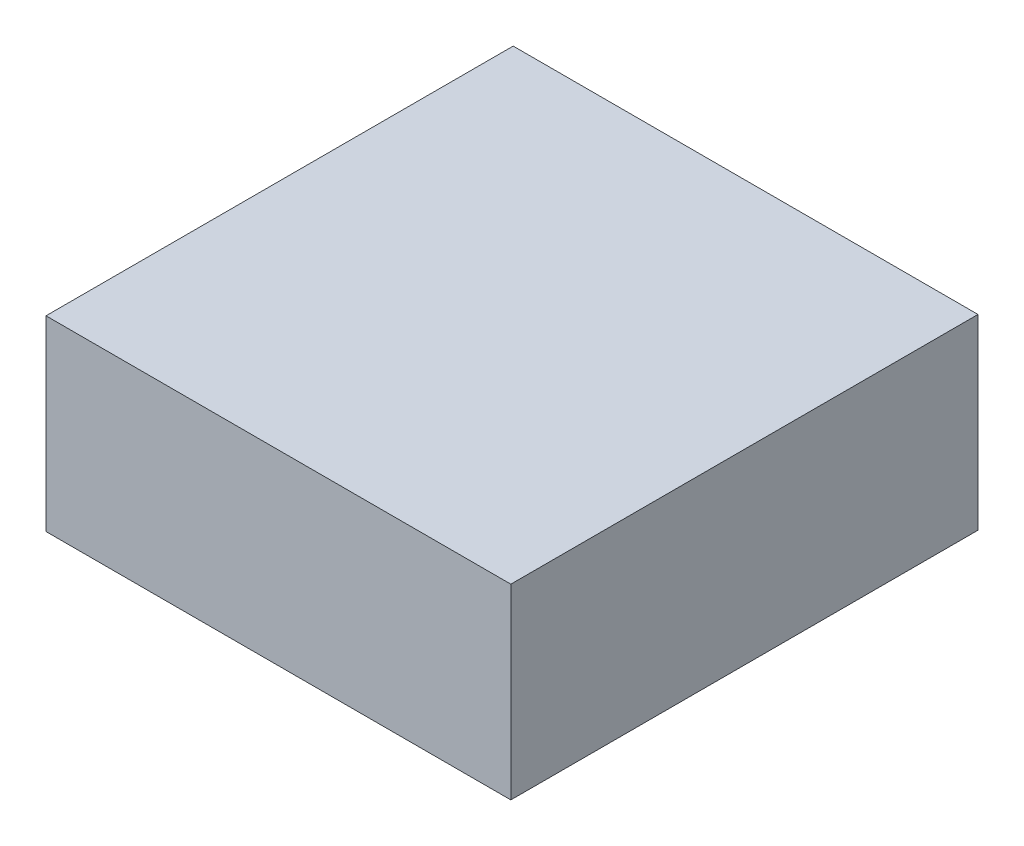
ISO-10303-21;
HEADER;
FILE_DESCRIPTION(('STEP AP214'),'2;1');
FILE_NAME('part.step','',(''),(''),'','','');
FILE_SCHEMA(('AUTOMOTIVE_DESIGN { 1 0 10303 214 1 1 1 1 }'));
ENDSEC;
DATA;
#1=APPLICATION_CONTEXT('core data for automotive mechanical design processes');
#2=APPLICATION_PROTOCOL_DEFINITION('international standard','automotive_design',2000,#1);
#3=PRODUCT_CONTEXT('',#1,'mechanical');
#4=PRODUCT('Part','Part','',(#3));
#5=PRODUCT_RELATED_PRODUCT_CATEGORY('part','',(#4));
#6=PRODUCT_DEFINITION_FORMATION('','',#4);
#7=PRODUCT_DEFINITION_CONTEXT('part definition',#1,'design');
#8=PRODUCT_DEFINITION('design','',#6,#7);
#9=PRODUCT_DEFINITION_SHAPE('','',#8);
#10=(LENGTH_UNIT() NAMED_UNIT(*) SI_UNIT(.MILLI.,.METRE.));
#11=(NAMED_UNIT(*) PLANE_ANGLE_UNIT() SI_UNIT($,.RADIAN.));
#12=(NAMED_UNIT(*) SI_UNIT($,.STERADIAN.) SOLID_ANGLE_UNIT());
#13=UNCERTAINTY_MEASURE_WITH_UNIT(LENGTH_MEASURE(1.E-05),#10,'distance_accuracy_value','');
#14=(GEOMETRIC_REPRESENTATION_CONTEXT(3) GLOBAL_UNCERTAINTY_ASSIGNED_CONTEXT((#13)) GLOBAL_UNIT_ASSIGNED_CONTEXT((#10,
#11,#12)) REPRESENTATION_CONTEXT('',''));
#15=CARTESIAN_POINT('',(0.,0.,0.));
#16=DIRECTION('',(0.,0.,1.));
#17=DIRECTION('',(1.,0.,0.));
#18=AXIS2_PLACEMENT_3D('',#15,#16,#17);
#19=CARTESIAN_POINT('',(-9.95,0.,10.));
#20=DIRECTION('',(1.,0.,0.));
#21=DIRECTION('',(0.,0.,-1.));
#22=AXIS2_PLACEMENT_3D('',#19,#20,#21);
#23=PLANE('',#22);
#24=DIRECTION('',(0.,-1.,0.));
#25=VECTOR('',#24,1.);
#26=CARTESIAN_POINT('',(-9.95,0.,-10.));
#27=LINE('',#26,#25);
#28=CARTESIAN_POINT('',(-9.95,8.,-10.));
#29=VERTEX_POINT('',#28);
#30=CARTESIAN_POINT('',(-9.95,0.,-10.));
#31=VERTEX_POINT('',#30);
#32=EDGE_CURVE('E96',#29,#31,#27,.T.);
#33=ORIENTED_EDGE('',*,*,#32,.T.);
#34=DIRECTION('',(0.,0.,-1.));
#35=VECTOR('',#34,1.);
#36=CARTESIAN_POINT('',(-9.95,0.,10.));
#37=LINE('',#36,#35);
#38=CARTESIAN_POINT('',(-9.95,0.,10.));
#39=VERTEX_POINT('',#38);
#40=EDGE_CURVE('E11',#39,#31,#37,.T.);
#41=ORIENTED_EDGE('',*,*,#40,.F.);
#42=DIRECTION('',(0.,-1.,0.));
#43=VECTOR('',#42,1.);
#44=CARTESIAN_POINT('',(-9.95,0.,10.));
#45=LINE('',#44,#43);
#46=CARTESIAN_POINT('',(-9.95,8.,10.));
#47=VERTEX_POINT('',#46);
#48=EDGE_CURVE('E84',#47,#39,#45,.T.);
#49=ORIENTED_EDGE('',*,*,#48,.F.);
#50=DIRECTION('',(0.,0.,-1.));
#51=VECTOR('',#50,1.);
#52=CARTESIAN_POINT('',(-9.95,8.,10.));
#53=LINE('',#52,#51);
#54=EDGE_CURVE('E92',#47,#29,#53,.T.);
#55=ORIENTED_EDGE('',*,*,#54,.T.);
#56=EDGE_LOOP('',(#33,#41,#49,#55));
#57=FACE_BOUND('',#56,.T.);
#58=ADVANCED_FACE('F33',(#57),#23,.F.);
#59=CARTESIAN_POINT('',(-9.95,0.,10.));
#60=DIRECTION('',(0.,1.,0.));
#61=DIRECTION('',(0.,0.,1.));
#62=AXIS2_PLACEMENT_3D('',#59,#60,#61);
#63=PLANE('',#62);
#64=DIRECTION('',(1.,0.,0.));
#65=VECTOR('',#64,1.);
#66=CARTESIAN_POINT('',(-9.95,0.,-10.));
#67=LINE('',#66,#65);
#68=CARTESIAN_POINT('',(9.95,0.,-10.));
#69=VERTEX_POINT('',#68);
#70=EDGE_CURVE('E88',#31,#69,#67,.T.);
#71=ORIENTED_EDGE('',*,*,#70,.T.);
#72=DIRECTION('',(0.,0.,-1.));
#73=VECTOR('',#72,1.);
#74=CARTESIAN_POINT('',(9.95,0.,10.));
#75=LINE('',#74,#73);
#76=CARTESIAN_POINT('',(9.95,0.,10.));
#77=VERTEX_POINT('',#76);
#78=EDGE_CURVE('E41',#77,#69,#75,.T.);
#79=ORIENTED_EDGE('',*,*,#78,.F.);
#80=DIRECTION('',(1.,0.,0.));
#81=VECTOR('',#80,1.);
#82=CARTESIAN_POINT('',(-9.95,0.,10.));
#83=LINE('',#82,#81);
#84=EDGE_CURVE('E79',#39,#77,#83,.T.);
#85=ORIENTED_EDGE('',*,*,#84,.F.);
#86=ORIENTED_EDGE('',*,*,#40,.T.);
#87=EDGE_LOOP('',(#71,#79,#85,#86));
#88=FACE_BOUND('',#87,.T.);
#89=ADVANCED_FACE('F87',(#88),#63,.F.);
#90=CARTESIAN_POINT('',(9.95,0.,10.));
#91=DIRECTION('',(-1.,0.,0.));
#92=DIRECTION('',(0.,0.,1.));
#93=AXIS2_PLACEMENT_3D('',#90,#91,#92);
#94=PLANE('',#93);
#95=DIRECTION('',(0.,1.,0.));
#96=VECTOR('',#95,1.);
#97=CARTESIAN_POINT('',(9.95,0.,-10.));
#98=LINE('',#97,#96);
#99=CARTESIAN_POINT('',(9.95,8.,-10.));
#100=VERTEX_POINT('',#99);
#101=EDGE_CURVE('E66',#69,#100,#98,.T.);
#102=ORIENTED_EDGE('',*,*,#101,.T.);
#103=DIRECTION('',(0.,0.,-1.));
#104=VECTOR('',#103,1.);
#105=CARTESIAN_POINT('',(9.95,8.,10.));
#106=LINE('',#105,#104);
#107=CARTESIAN_POINT('',(9.95,8.,10.));
#108=VERTEX_POINT('',#107);
#109=EDGE_CURVE('E89',#108,#100,#106,.T.);
#110=ORIENTED_EDGE('',*,*,#109,.F.);
#111=DIRECTION('',(0.,1.,0.));
#112=VECTOR('',#111,1.);
#113=CARTESIAN_POINT('',(9.95,0.,10.));
#114=LINE('',#113,#112);
#115=EDGE_CURVE('E82',#77,#108,#114,.T.);
#116=ORIENTED_EDGE('',*,*,#115,.F.);
#117=ORIENTED_EDGE('',*,*,#78,.T.);
#118=EDGE_LOOP('',(#102,#110,#116,#117));
#119=FACE_BOUND('',#118,.T.);
#120=ADVANCED_FACE('F90',(#119),#94,.F.);
#121=CARTESIAN_POINT('',(-9.95,8.,10.));
#122=DIRECTION('',(0.,-1.,0.));
#123=DIRECTION('',(0.,0.,-1.));
#124=AXIS2_PLACEMENT_3D('',#121,#122,#123);
#125=PLANE('',#124);
#126=DIRECTION('',(-1.,0.,0.));
#127=VECTOR('',#126,1.);
#128=CARTESIAN_POINT('',(-9.95,8.,-10.));
#129=LINE('',#128,#127);
#130=EDGE_CURVE('E72',#100,#29,#129,.T.);
#131=ORIENTED_EDGE('',*,*,#130,.T.);
#132=ORIENTED_EDGE('',*,*,#54,.F.);
#133=DIRECTION('',(-1.,0.,0.));
#134=VECTOR('',#133,1.);
#135=CARTESIAN_POINT('',(-9.95,8.,10.));
#136=LINE('',#135,#134);
#137=EDGE_CURVE('E49',#108,#47,#136,.T.);
#138=ORIENTED_EDGE('',*,*,#137,.F.);
#139=ORIENTED_EDGE('',*,*,#109,.T.);
#140=EDGE_LOOP('',(#131,#132,#138,#139));
#141=FACE_BOUND('',#140,.T.);
#142=ADVANCED_FACE('F103',(#141),#125,.F.);
#143=CARTESIAN_POINT('',(0.,0.,10.));
#144=DIRECTION('',(0.,0.,-1.));
#145=DIRECTION('',(-1.,0.,0.));
#146=AXIS2_PLACEMENT_3D('',#143,#144,#145);
#147=PLANE('',#146);
#148=ORIENTED_EDGE('',*,*,#48,.T.);
#149=ORIENTED_EDGE('',*,*,#84,.T.);
#150=ORIENTED_EDGE('',*,*,#115,.T.);
#151=ORIENTED_EDGE('',*,*,#137,.T.);
#152=EDGE_LOOP('',(#148,#149,#150,#151));
#153=FACE_BOUND('',#152,.T.);
#154=ADVANCED_FACE('F80',(#153),#147,.F.);
#155=CARTESIAN_POINT('',(0.,0.,-10.));
#156=DIRECTION('',(0.,0.,-1.));
#157=DIRECTION('',(-1.,0.,0.));
#158=AXIS2_PLACEMENT_3D('',#155,#156,#157);
#159=PLANE('',#158);
#160=ORIENTED_EDGE('',*,*,#32,.F.);
#161=ORIENTED_EDGE('',*,*,#130,.F.);
#162=ORIENTED_EDGE('',*,*,#101,.F.);
#163=ORIENTED_EDGE('',*,*,#70,.F.);
#164=EDGE_LOOP('',(#160,#161,#162,#163));
#165=FACE_BOUND('',#164,.T.);
#166=ADVANCED_FACE('F106',(#165),#159,.T.);
#167=CLOSED_SHELL('',(#58,#89,#120,#142,#154,#166));
#168=MANIFOLD_SOLID_BREP('B2',#167);
#169=ADVANCED_BREP_SHAPE_REPRESENTATION('',(#18,#168),#14);
#170=SHAPE_DEFINITION_REPRESENTATION(#9,#169);
ENDSEC;
END-ISO-10303-21;
